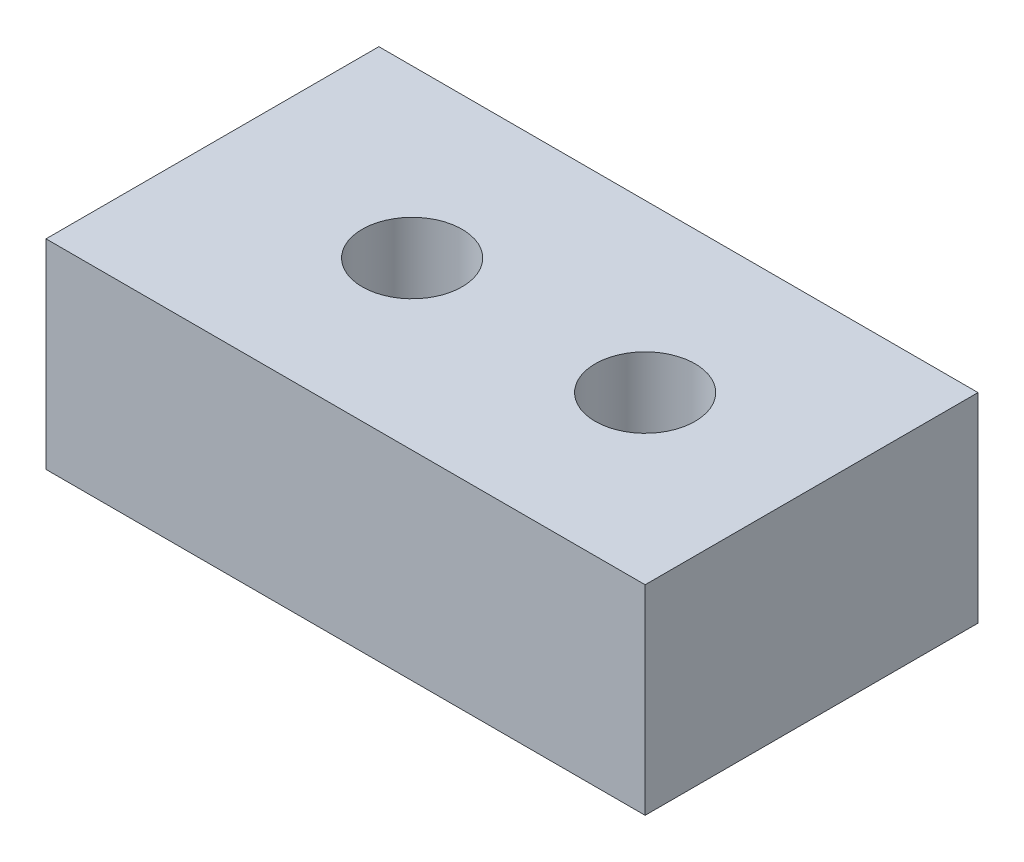
ISO-10303-21;
HEADER;
FILE_DESCRIPTION(('STEP AP214'),'2;1');
FILE_NAME('part.step','',(''),(''),'','','');
FILE_SCHEMA(('AUTOMOTIVE_DESIGN { 1 0 10303 214 1 1 1 1 }'));
ENDSEC;
DATA;
#1=APPLICATION_CONTEXT('core data for automotive mechanical design processes');
#2=APPLICATION_PROTOCOL_DEFINITION('international standard','automotive_design',2000,#1);
#3=PRODUCT_CONTEXT('',#1,'mechanical');
#4=PRODUCT('Part','Part','',(#3));
#5=PRODUCT_RELATED_PRODUCT_CATEGORY('part','',(#4));
#6=PRODUCT_DEFINITION_FORMATION('','',#4);
#7=PRODUCT_DEFINITION_CONTEXT('part definition',#1,'design');
#8=PRODUCT_DEFINITION('design','',#6,#7);
#9=PRODUCT_DEFINITION_SHAPE('','',#8);
#10=(LENGTH_UNIT() NAMED_UNIT(*) SI_UNIT(.MILLI.,.METRE.));
#11=(NAMED_UNIT(*) PLANE_ANGLE_UNIT() SI_UNIT($,.RADIAN.));
#12=(NAMED_UNIT(*) SI_UNIT($,.STERADIAN.) SOLID_ANGLE_UNIT());
#13=UNCERTAINTY_MEASURE_WITH_UNIT(LENGTH_MEASURE(1.E-05),#10,'distance_accuracy_value','');
#14=(GEOMETRIC_REPRESENTATION_CONTEXT(3) GLOBAL_UNCERTAINTY_ASSIGNED_CONTEXT((#13)) GLOBAL_UNIT_ASSIGNED_CONTEXT((#10,
#11,#12)) REPRESENTATION_CONTEXT('',''));
#15=CARTESIAN_POINT('',(0.,0.,0.));
#16=DIRECTION('',(0.,0.,1.));
#17=DIRECTION('',(1.,0.,0.));
#18=AXIS2_PLACEMENT_3D('',#15,#16,#17);
#19=CARTESIAN_POINT('',(9.,6.,5.));
#20=DIRECTION('',(-1.,0.,0.));
#21=DIRECTION('',(0.,0.,1.));
#22=AXIS2_PLACEMENT_3D('',#19,#20,#21);
#23=PLANE('',#22);
#24=DIRECTION('',(0.,0.,-1.));
#25=VECTOR('',#24,1.);
#26=CARTESIAN_POINT('',(9.,0.,5.));
#27=LINE('',#26,#25);
#28=CARTESIAN_POINT('',(9.,0.,5.));
#29=VERTEX_POINT('',#28);
#30=CARTESIAN_POINT('',(9.,0.,-5.));
#31=VERTEX_POINT('',#30);
#32=EDGE_CURVE('E107',#29,#31,#27,.T.);
#33=ORIENTED_EDGE('',*,*,#32,.T.);
#34=DIRECTION('',(0.,-1.,0.));
#35=VECTOR('',#34,1.);
#36=CARTESIAN_POINT('',(9.,6.,-5.));
#37=LINE('',#36,#35);
#38=CARTESIAN_POINT('',(9.,6.,-5.));
#39=VERTEX_POINT('',#38);
#40=EDGE_CURVE('E11',#39,#31,#37,.T.);
#41=ORIENTED_EDGE('',*,*,#40,.F.);
#42=DIRECTION('',(0.,0.,-1.));
#43=VECTOR('',#42,1.);
#44=CARTESIAN_POINT('',(9.,6.,5.));
#45=LINE('',#44,#43);
#46=CARTESIAN_POINT('',(9.,6.,5.));
#47=VERTEX_POINT('',#46);
#48=EDGE_CURVE('E91',#47,#39,#45,.T.);
#49=ORIENTED_EDGE('',*,*,#48,.F.);
#50=DIRECTION('',(0.,-1.,0.));
#51=VECTOR('',#50,1.);
#52=CARTESIAN_POINT('',(9.,6.,5.));
#53=LINE('',#52,#51);
#54=EDGE_CURVE('E103',#47,#29,#53,.T.);
#55=ORIENTED_EDGE('',*,*,#54,.T.);
#56=EDGE_LOOP('',(#33,#41,#49,#55));
#57=FACE_BOUND('',#56,.T.);
#58=ADVANCED_FACE('F39',(#57),#23,.F.);
#59=CARTESIAN_POINT('',(-9.,6.,-5.));
#60=DIRECTION('',(0.,0.,1.));
#61=DIRECTION('',(1.,0.,0.));
#62=AXIS2_PLACEMENT_3D('',#59,#60,#61);
#63=PLANE('',#62);
#64=DIRECTION('',(-1.,0.,0.));
#65=VECTOR('',#64,1.);
#66=CARTESIAN_POINT('',(-9.,0.,-5.));
#67=LINE('',#66,#65);
#68=CARTESIAN_POINT('',(-9.,0.,-5.));
#69=VERTEX_POINT('',#68);
#70=EDGE_CURVE('E96',#31,#69,#67,.T.);
#71=ORIENTED_EDGE('',*,*,#70,.T.);
#72=DIRECTION('',(0.,-1.,0.));
#73=VECTOR('',#72,1.);
#74=CARTESIAN_POINT('',(-9.,6.,-5.));
#75=LINE('',#74,#73);
#76=CARTESIAN_POINT('',(-9.,6.,-5.));
#77=VERTEX_POINT('',#76);
#78=EDGE_CURVE('E48',#77,#69,#75,.T.);
#79=ORIENTED_EDGE('',*,*,#78,.F.);
#80=DIRECTION('',(-1.,0.,0.));
#81=VECTOR('',#80,1.);
#82=CARTESIAN_POINT('',(-9.,6.,-5.));
#83=LINE('',#82,#81);
#84=EDGE_CURVE('E86',#39,#77,#83,.T.);
#85=ORIENTED_EDGE('',*,*,#84,.F.);
#86=ORIENTED_EDGE('',*,*,#40,.T.);
#87=EDGE_LOOP('',(#71,#79,#85,#86));
#88=FACE_BOUND('',#87,.T.);
#89=ADVANCED_FACE('F95',(#88),#63,.F.);
#90=CARTESIAN_POINT('',(-9.,6.,5.));
#91=DIRECTION('',(1.,0.,0.));
#92=DIRECTION('',(0.,0.,-1.));
#93=AXIS2_PLACEMENT_3D('',#90,#91,#92);
#94=PLANE('',#93);
#95=DIRECTION('',(0.,0.,1.));
#96=VECTOR('',#95,1.);
#97=CARTESIAN_POINT('',(-9.,0.,5.));
#98=LINE('',#97,#96);
#99=CARTESIAN_POINT('',(-9.,0.,5.));
#100=VERTEX_POINT('',#99);
#101=EDGE_CURVE('E73',#69,#100,#98,.T.);
#102=ORIENTED_EDGE('',*,*,#101,.T.);
#103=DIRECTION('',(0.,-1.,0.));
#104=VECTOR('',#103,1.);
#105=CARTESIAN_POINT('',(-9.,6.,5.));
#106=LINE('',#105,#104);
#107=CARTESIAN_POINT('',(-9.,6.,5.));
#108=VERTEX_POINT('',#107);
#109=EDGE_CURVE('E98',#108,#100,#106,.T.);
#110=ORIENTED_EDGE('',*,*,#109,.F.);
#111=DIRECTION('',(0.,0.,1.));
#112=VECTOR('',#111,1.);
#113=CARTESIAN_POINT('',(-9.,6.,5.));
#114=LINE('',#113,#112);
#115=EDGE_CURVE('E89',#77,#108,#114,.T.);
#116=ORIENTED_EDGE('',*,*,#115,.F.);
#117=ORIENTED_EDGE('',*,*,#78,.T.);
#118=EDGE_LOOP('',(#102,#110,#116,#117));
#119=FACE_BOUND('',#118,.T.);
#120=ADVANCED_FACE('F99',(#119),#94,.F.);
#121=CARTESIAN_POINT('',(-9.,6.,5.));
#122=DIRECTION('',(0.,0.,-1.));
#123=DIRECTION('',(-1.,0.,0.));
#124=AXIS2_PLACEMENT_3D('',#121,#122,#123);
#125=PLANE('',#124);
#126=DIRECTION('',(1.,0.,0.));
#127=VECTOR('',#126,1.);
#128=CARTESIAN_POINT('',(-9.,0.,5.));
#129=LINE('',#128,#127);
#130=EDGE_CURVE('E79',#100,#29,#129,.T.);
#131=ORIENTED_EDGE('',*,*,#130,.T.);
#132=ORIENTED_EDGE('',*,*,#54,.F.);
#133=DIRECTION('',(1.,0.,0.));
#134=VECTOR('',#133,1.);
#135=CARTESIAN_POINT('',(-9.,6.,5.));
#136=LINE('',#135,#134);
#137=EDGE_CURVE('E56',#108,#47,#136,.T.);
#138=ORIENTED_EDGE('',*,*,#137,.F.);
#139=ORIENTED_EDGE('',*,*,#109,.T.);
#140=EDGE_LOOP('',(#131,#132,#138,#139));
#141=FACE_BOUND('',#140,.T.);
#142=ADVANCED_FACE('F121',(#141),#125,.F.);
#143=CARTESIAN_POINT('',(0.,6.,0.));
#144=DIRECTION('',(0.,-1.,0.));
#145=DIRECTION('',(0.,0.,-1.));
#146=AXIS2_PLACEMENT_3D('',#143,#144,#145);
#147=PLANE('',#146);
#148=CARTESIAN_POINT('',(-3.,6.,0.));
#149=DIRECTION('',(0.,1.,0.));
#150=DIRECTION('',(0.,0.,1.));
#151=AXIS2_PLACEMENT_3D('',#148,#149,#150);
#152=CIRCLE('',#151,1.5);
#153=CARTESIAN_POINT('',(-3.,6.,1.5));
#154=VERTEX_POINT('',#153);
#155=EDGE_CURVE('E136',#154,#154,#152,.T.);
#156=ORIENTED_EDGE('',*,*,#155,.F.);
#157=EDGE_LOOP('',(#156));
#158=FACE_BOUND('',#157,.T.);
#159=CARTESIAN_POINT('',(4.,6.,0.));
#160=DIRECTION('',(0.,1.,0.));
#161=DIRECTION('',(0.,0.,1.));
#162=AXIS2_PLACEMENT_3D('',#159,#160,#161);
#163=CIRCLE('',#162,1.5);
#164=CARTESIAN_POINT('',(4.,6.,1.5));
#165=VERTEX_POINT('',#164);
#166=EDGE_CURVE('E128',#165,#165,#163,.T.);
#167=ORIENTED_EDGE('',*,*,#166,.F.);
#168=EDGE_LOOP('',(#167));
#169=FACE_BOUND('',#168,.T.);
#170=ORIENTED_EDGE('',*,*,#48,.T.);
#171=ORIENTED_EDGE('',*,*,#84,.T.);
#172=ORIENTED_EDGE('',*,*,#115,.T.);
#173=ORIENTED_EDGE('',*,*,#137,.T.);
#174=EDGE_LOOP('',(#170,#171,#172,#173));
#175=FACE_BOUND('',#174,.T.);
#176=ADVANCED_FACE('F87',(#158,#169,#175),#147,.F.);
#177=CARTESIAN_POINT('',(0.,0.,0.));
#178=DIRECTION('',(0.,-1.,0.));
#179=DIRECTION('',(0.,0.,-1.));
#180=AXIS2_PLACEMENT_3D('',#177,#178,#179);
#181=PLANE('',#180);
#182=CARTESIAN_POINT('',(-3.,0.,0.));
#183=DIRECTION('',(0.,1.,0.));
#184=DIRECTION('',(0.,0.,1.));
#185=AXIS2_PLACEMENT_3D('',#182,#183,#184);
#186=CIRCLE('',#185,1.5);
#187=CARTESIAN_POINT('',(-3.,0.,1.5));
#188=VERTEX_POINT('',#187);
#189=EDGE_CURVE('E111',#188,#188,#186,.T.);
#190=ORIENTED_EDGE('',*,*,#189,.T.);
#191=EDGE_LOOP('',(#190));
#192=FACE_BOUND('',#191,.T.);
#193=CARTESIAN_POINT('',(4.,0.,0.));
#194=DIRECTION('',(0.,1.,0.));
#195=DIRECTION('',(0.,0.,1.));
#196=AXIS2_PLACEMENT_3D('',#193,#194,#195);
#197=CIRCLE('',#196,1.5);
#198=CARTESIAN_POINT('',(4.,0.,1.5));
#199=VERTEX_POINT('',#198);
#200=EDGE_CURVE('E132',#199,#199,#197,.T.);
#201=ORIENTED_EDGE('',*,*,#200,.T.);
#202=EDGE_LOOP('',(#201));
#203=FACE_BOUND('',#202,.T.);
#204=ORIENTED_EDGE('',*,*,#32,.F.);
#205=ORIENTED_EDGE('',*,*,#130,.F.);
#206=ORIENTED_EDGE('',*,*,#101,.F.);
#207=ORIENTED_EDGE('',*,*,#70,.F.);
#208=EDGE_LOOP('',(#204,#205,#206,#207));
#209=FACE_BOUND('',#208,.T.);
#210=ADVANCED_FACE('F124',(#192,#203,#209),#181,.T.);
#211=CARTESIAN_POINT('',(4.,0.,0.));
#212=DIRECTION('',(0.,1.,0.));
#213=DIRECTION('',(0.,0.,1.));
#214=AXIS2_PLACEMENT_3D('',#211,#212,#213);
#215=CYLINDRICAL_SURFACE('',#214,1.5);
#216=ORIENTED_EDGE('',*,*,#200,.F.);
#217=EDGE_LOOP('',(#216));
#218=FACE_BOUND('',#217,.T.);
#219=ORIENTED_EDGE('',*,*,#166,.T.);
#220=EDGE_LOOP('',(#219));
#221=FACE_BOUND('',#220,.T.);
#222=ADVANCED_FACE('F149',(#218,#221),#215,.F.);
#223=CARTESIAN_POINT('',(-3.,0.,0.));
#224=DIRECTION('',(0.,1.,0.));
#225=DIRECTION('',(0.,0.,1.));
#226=AXIS2_PLACEMENT_3D('',#223,#224,#225);
#227=CYLINDRICAL_SURFACE('',#226,1.5);
#228=ORIENTED_EDGE('',*,*,#189,.F.);
#229=EDGE_LOOP('',(#228));
#230=FACE_BOUND('',#229,.T.);
#231=ORIENTED_EDGE('',*,*,#155,.T.);
#232=EDGE_LOOP('',(#231));
#233=FACE_BOUND('',#232,.T.);
#234=ADVANCED_FACE('F146',(#230,#233),#227,.F.);
#235=CLOSED_SHELL('',(#58,#89,#120,#142,#176,#210,#222,#234));
#236=MANIFOLD_SOLID_BREP('B2',#235);
#237=ADVANCED_BREP_SHAPE_REPRESENTATION('',(#18,#236),#14);
#238=SHAPE_DEFINITION_REPRESENTATION(#9,#237);
ENDSEC;
END-ISO-10303-21;
